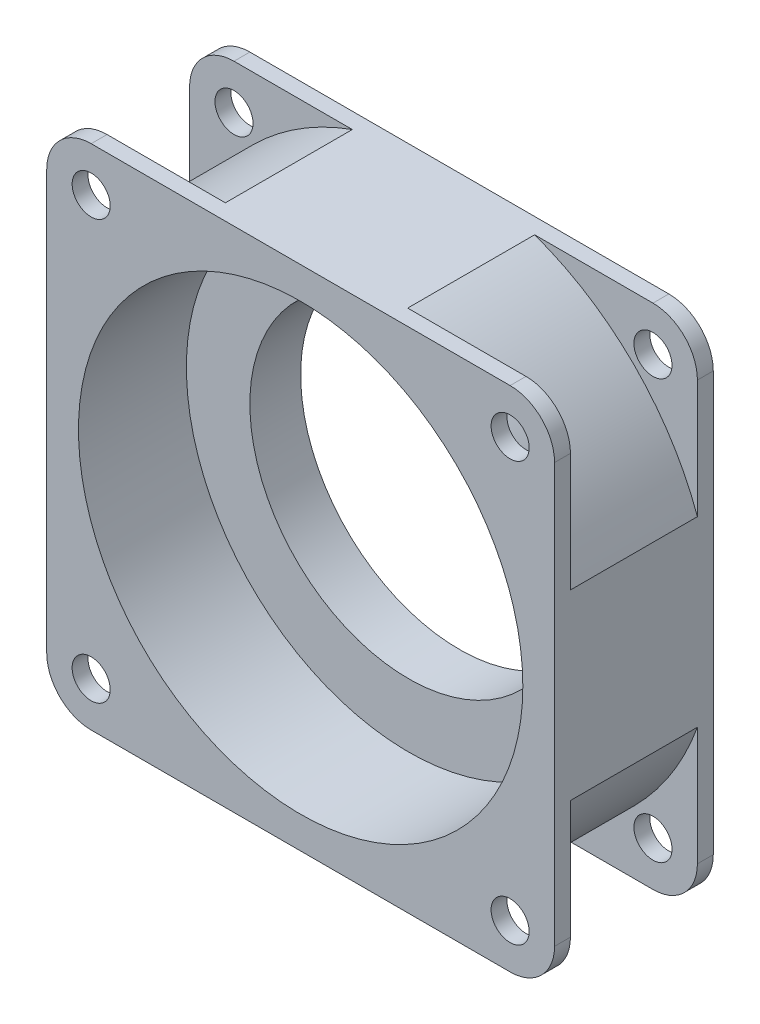
ISO-10303-21;
HEADER;
FILE_DESCRIPTION(('STEP AP214'),'2;1');
FILE_NAME('part.step','',(''),(''),'','','');
FILE_SCHEMA(('AUTOMOTIVE_DESIGN { 1 0 10303 214 1 1 1 1 }'));
ENDSEC;
DATA;
#1=APPLICATION_CONTEXT('core data for automotive mechanical design processes');
#2=APPLICATION_PROTOCOL_DEFINITION('international standard','automotive_design',2000,#1);
#3=PRODUCT_CONTEXT('',#1,'mechanical');
#4=PRODUCT('Part','Part','',(#3));
#5=PRODUCT_RELATED_PRODUCT_CATEGORY('part','',(#4));
#6=PRODUCT_DEFINITION_FORMATION('','',#4);
#7=PRODUCT_DEFINITION_CONTEXT('part definition',#1,'design');
#8=PRODUCT_DEFINITION('design','',#6,#7);
#9=PRODUCT_DEFINITION_SHAPE('','',#8);
#10=(LENGTH_UNIT() NAMED_UNIT(*) SI_UNIT(.MILLI.,.METRE.));
#11=(NAMED_UNIT(*) PLANE_ANGLE_UNIT() SI_UNIT($,.RADIAN.));
#12=(NAMED_UNIT(*) SI_UNIT($,.STERADIAN.) SOLID_ANGLE_UNIT());
#13=UNCERTAINTY_MEASURE_WITH_UNIT(LENGTH_MEASURE(1.E-05),#10,'distance_accuracy_value','');
#14=(GEOMETRIC_REPRESENTATION_CONTEXT(3) GLOBAL_UNCERTAINTY_ASSIGNED_CONTEXT((#13)) GLOBAL_UNIT_ASSIGNED_CONTEXT((#10,
#11,#12)) REPRESENTATION_CONTEXT('',''));
#15=CARTESIAN_POINT('',(0.,0.,0.));
#16=DIRECTION('',(0.,0.,1.));
#17=DIRECTION('',(1.,0.,0.));
#18=AXIS2_PLACEMENT_3D('',#15,#16,#17);
#19=CARTESIAN_POINT('',(0.,0.,12.5));
#20=DIRECTION('',(0.,0.,-1.));
#21=DIRECTION('',(-1.,0.,0.));
#22=AXIS2_PLACEMENT_3D('',#19,#20,#21);
#23=CYLINDRICAL_SURFACE('',#22,25.);
#24=CARTESIAN_POINT('',(0.,0.,-12.5));
#25=DIRECTION('',(0.,0.,1.));
#26=DIRECTION('',(1.,0.,0.));
#27=AXIS2_PLACEMENT_3D('',#24,#25,#26);
#28=CIRCLE('',#27,25.);
#29=CARTESIAN_POINT('',(25.,0.,-12.5));
#30=VERTEX_POINT('',#29);
#31=EDGE_CURVE('E305',#30,#30,#28,.T.);
#32=ORIENTED_EDGE('',*,*,#31,.F.);
#33=EDGE_LOOP('',(#32));
#34=FACE_BOUND('',#33,.T.);
#35=CARTESIAN_POINT('',(0.,0.,-4.5));
#36=DIRECTION('',(0.,0.,1.));
#37=DIRECTION('',(1.,0.,0.));
#38=AXIS2_PLACEMENT_3D('',#35,#36,#37);
#39=CIRCLE('',#38,25.);
#40=CARTESIAN_POINT('',(25.,0.,-4.5));
#41=VERTEX_POINT('',#40);
#42=EDGE_CURVE('E539',#41,#41,#39,.T.);
#43=ORIENTED_EDGE('',*,*,#42,.T.);
#44=EDGE_LOOP('',(#43));
#45=FACE_BOUND('',#44,.T.);
#46=ADVANCED_FACE('F50',(#34,#45),#23,.F.);
#47=CARTESIAN_POINT('',(0.,40.,12.5));
#48=DIRECTION('',(0.,1.,0.));
#49=DIRECTION('',(0.,0.,1.));
#50=AXIS2_PLACEMENT_3D('',#47,#48,#49);
#51=PLANE('',#50);
#52=DIRECTION('',(0.,0.,-1.));
#53=VECTOR('',#52,1.);
#54=CARTESIAN_POINT('',(33.,40.,12.5));
#55=LINE('',#54,#53);
#56=CARTESIAN_POINT('',(33.,40.,12.5));
#57=VERTEX_POINT('',#56);
#58=CARTESIAN_POINT('',(33.,40.,10.));
#59=VERTEX_POINT('',#58);
#60=EDGE_CURVE('E12',#57,#59,#55,.T.);
#61=ORIENTED_EDGE('',*,*,#60,.T.);
#62=DIRECTION('',(-1.,0.,0.));
#63=VECTOR('',#62,1.);
#64=CARTESIAN_POINT('',(0.,40.,10.));
#65=LINE('',#64,#63);
#66=CARTESIAN_POINT('',(14.3614066163451,40.,10.));
#67=VERTEX_POINT('',#66);
#68=EDGE_CURVE('E454',#59,#67,#65,.T.);
#69=ORIENTED_EDGE('',*,*,#68,.T.);
#70=DIRECTION('',(0.,0.,1.));
#71=VECTOR('',#70,1.);
#72=CARTESIAN_POINT('',(14.3614066163451,40.,-10.));
#73=LINE('',#72,#71);
#74=CARTESIAN_POINT('',(14.3614066163451,40.,-10.));
#75=VERTEX_POINT('',#74);
#76=EDGE_CURVE('E229',#75,#67,#73,.T.);
#77=ORIENTED_EDGE('',*,*,#76,.F.);
#78=DIRECTION('',(-1.,0.,0.));
#79=VECTOR('',#78,1.);
#80=CARTESIAN_POINT('',(0.,40.,-10.));
#81=LINE('',#80,#79);
#82=CARTESIAN_POINT('',(33.,40.,-10.));
#83=VERTEX_POINT('',#82);
#84=EDGE_CURVE('E212',#83,#75,#81,.T.);
#85=ORIENTED_EDGE('',*,*,#84,.F.);
#86=CARTESIAN_POINT('',(33.,40.,-12.5));
#87=VERTEX_POINT('',#86);
#88=EDGE_CURVE('E57',#83,#87,#55,.T.);
#89=ORIENTED_EDGE('',*,*,#88,.T.);
#90=DIRECTION('',(1.,0.,0.));
#91=VECTOR('',#90,1.);
#92=CARTESIAN_POINT('',(0.,40.,-12.5));
#93=LINE('',#92,#91);
#94=CARTESIAN_POINT('',(-33.,40.,-12.5));
#95=VERTEX_POINT('',#94);
#96=EDGE_CURVE('E264',#95,#87,#93,.T.);
#97=ORIENTED_EDGE('',*,*,#96,.F.);
#98=DIRECTION('',(0.,0.,-1.));
#99=VECTOR('',#98,1.);
#100=CARTESIAN_POINT('',(-33.,40.,12.5));
#101=LINE('',#100,#99);
#102=CARTESIAN_POINT('',(-33.,40.,-10.));
#103=VERTEX_POINT('',#102);
#104=EDGE_CURVE('E237',#103,#95,#101,.T.);
#105=ORIENTED_EDGE('',*,*,#104,.F.);
#106=DIRECTION('',(1.,0.,0.));
#107=VECTOR('',#106,1.);
#108=CARTESIAN_POINT('',(0.,40.,-10.));
#109=LINE('',#108,#107);
#110=CARTESIAN_POINT('',(-14.3614066163451,40.,-10.));
#111=VERTEX_POINT('',#110);
#112=EDGE_CURVE('E378',#103,#111,#109,.T.);
#113=ORIENTED_EDGE('',*,*,#112,.T.);
#114=DIRECTION('',(0.,0.,1.));
#115=VECTOR('',#114,1.);
#116=CARTESIAN_POINT('',(-14.3614066163451,40.,-10.));
#117=LINE('',#116,#115);
#118=CARTESIAN_POINT('',(-14.3614066163451,40.,10.));
#119=VERTEX_POINT('',#118);
#120=EDGE_CURVE('E241',#111,#119,#117,.T.);
#121=ORIENTED_EDGE('',*,*,#120,.T.);
#122=DIRECTION('',(1.,0.,0.));
#123=VECTOR('',#122,1.);
#124=CARTESIAN_POINT('',(0.,40.,10.));
#125=LINE('',#124,#123);
#126=CARTESIAN_POINT('',(-33.,40.,10.));
#127=VERTEX_POINT('',#126);
#128=EDGE_CURVE('E389',#127,#119,#125,.T.);
#129=ORIENTED_EDGE('',*,*,#128,.F.);
#130=CARTESIAN_POINT('',(-33.,40.,12.5));
#131=VERTEX_POINT('',#130);
#132=EDGE_CURVE('E234',#131,#127,#101,.T.);
#133=ORIENTED_EDGE('',*,*,#132,.F.);
#134=DIRECTION('',(1.,0.,0.));
#135=VECTOR('',#134,1.);
#136=CARTESIAN_POINT('',(0.,40.,12.5));
#137=LINE('',#136,#135);
#138=EDGE_CURVE('E401',#131,#57,#137,.T.);
#139=ORIENTED_EDGE('',*,*,#138,.T.);
#140=EDGE_LOOP('',(#61,#69,#77,#85,#89,#97,#105,#113,#121,#129,#133,#139));
#141=FACE_BOUND('',#140,.T.);
#142=ADVANCED_FACE('F221',(#141),#51,.T.);
#143=CARTESIAN_POINT('',(-40.,0.,12.5));
#144=DIRECTION('',(-1.,0.,0.));
#145=DIRECTION('',(0.,0.,1.));
#146=AXIS2_PLACEMENT_3D('',#143,#144,#145);
#147=PLANE('',#146);
#148=DIRECTION('',(0.,0.,1.));
#149=VECTOR('',#148,1.);
#150=CARTESIAN_POINT('',(-40.,-14.3614066163451,-10.));
#151=LINE('',#150,#149);
#152=CARTESIAN_POINT('',(-40.,-14.3614066163451,-10.));
#153=VERTEX_POINT('',#152);
#154=CARTESIAN_POINT('',(-40.,-14.3614066163451,10.));
#155=VERTEX_POINT('',#154);
#156=EDGE_CURVE('E360',#153,#155,#151,.T.);
#157=ORIENTED_EDGE('',*,*,#156,.T.);
#158=DIRECTION('',(0.,-1.,0.));
#159=VECTOR('',#158,1.);
#160=CARTESIAN_POINT('',(-40.,0.,10.));
#161=LINE('',#160,#159);
#162=CARTESIAN_POINT('',(-40.,-32.9999999999999,10.));
#163=VERTEX_POINT('',#162);
#164=EDGE_CURVE('E372',#155,#163,#161,.T.);
#165=ORIENTED_EDGE('',*,*,#164,.T.);
#166=DIRECTION('',(0.,0.,-1.));
#167=VECTOR('',#166,1.);
#168=CARTESIAN_POINT('',(-40.,-33.,12.5));
#169=LINE('',#168,#167);
#170=CARTESIAN_POINT('',(-40.,-33.,12.5));
#171=VERTEX_POINT('',#170);
#172=EDGE_CURVE('E323',#171,#163,#169,.T.);
#173=ORIENTED_EDGE('',*,*,#172,.F.);
#174=DIRECTION('',(0.,1.,0.));
#175=VECTOR('',#174,1.);
#176=CARTESIAN_POINT('',(-40.,0.,12.5));
#177=LINE('',#176,#175);
#178=CARTESIAN_POINT('',(-40.,33.,12.5));
#179=VERTEX_POINT('',#178);
#180=EDGE_CURVE('E409',#171,#179,#177,.T.);
#181=ORIENTED_EDGE('',*,*,#180,.T.);
#182=DIRECTION('',(0.,0.,-1.));
#183=VECTOR('',#182,1.);
#184=CARTESIAN_POINT('',(-40.,33.,12.5));
#185=LINE('',#184,#183);
#186=CARTESIAN_POINT('',(-40.,33.,10.));
#187=VERTEX_POINT('',#186);
#188=EDGE_CURVE('E326',#179,#187,#185,.T.);
#189=ORIENTED_EDGE('',*,*,#188,.T.);
#190=DIRECTION('',(0.,1.,0.));
#191=VECTOR('',#190,1.);
#192=CARTESIAN_POINT('',(-40.,0.,10.));
#193=LINE('',#192,#191);
#194=CARTESIAN_POINT('',(-40.,14.3614066163451,10.));
#195=VERTEX_POINT('',#194);
#196=EDGE_CURVE('E393',#195,#187,#193,.T.);
#197=ORIENTED_EDGE('',*,*,#196,.F.);
#198=DIRECTION('',(0.,0.,1.));
#199=VECTOR('',#198,1.);
#200=CARTESIAN_POINT('',(-40.,14.3614066163451,-10.));
#201=LINE('',#200,#199);
#202=CARTESIAN_POINT('',(-40.,14.3614066163451,-10.));
#203=VERTEX_POINT('',#202);
#204=EDGE_CURVE('E390',#203,#195,#201,.T.);
#205=ORIENTED_EDGE('',*,*,#204,.F.);
#206=DIRECTION('',(0.,1.,0.));
#207=VECTOR('',#206,1.);
#208=CARTESIAN_POINT('',(-40.,0.,-10.));
#209=LINE('',#208,#207);
#210=CARTESIAN_POINT('',(-40.,33.,-10.));
#211=VERTEX_POINT('',#210);
#212=EDGE_CURVE('E61',#203,#211,#209,.T.);
#213=ORIENTED_EDGE('',*,*,#212,.T.);
#214=CARTESIAN_POINT('',(-40.,33.,-12.5));
#215=VERTEX_POINT('',#214);
#216=EDGE_CURVE('E324',#211,#215,#185,.T.);
#217=ORIENTED_EDGE('',*,*,#216,.T.);
#218=DIRECTION('',(0.,1.,0.));
#219=VECTOR('',#218,1.);
#220=CARTESIAN_POINT('',(-40.,0.,-12.5));
#221=LINE('',#220,#219);
#222=CARTESIAN_POINT('',(-40.,-33.,-12.5));
#223=VERTEX_POINT('',#222);
#224=EDGE_CURVE('E274',#223,#215,#221,.T.);
#225=ORIENTED_EDGE('',*,*,#224,.F.);
#226=CARTESIAN_POINT('',(-40.,-32.9999999999999,-10.));
#227=VERTEX_POINT('',#226);
#228=EDGE_CURVE('E325',#227,#223,#169,.T.);
#229=ORIENTED_EDGE('',*,*,#228,.F.);
#230=DIRECTION('',(0.,-1.,0.));
#231=VECTOR('',#230,1.);
#232=CARTESIAN_POINT('',(-40.,0.,-10.));
#233=LINE('',#232,#231);
#234=EDGE_CURVE('E353',#153,#227,#233,.T.);
#235=ORIENTED_EDGE('',*,*,#234,.F.);
#236=EDGE_LOOP('',(#157,#165,#173,#181,#189,#197,#205,#213,#217,#225,#229,#235));
#237=FACE_BOUND('',#236,.T.);
#238=ADVANCED_FACE('F333',(#237),#147,.T.);
#239=CARTESIAN_POINT('',(0.,-40.,12.5));
#240=DIRECTION('',(0.,1.,0.));
#241=DIRECTION('',(0.,0.,1.));
#242=AXIS2_PLACEMENT_3D('',#239,#240,#241);
#243=PLANE('',#242);
#244=DIRECTION('',(0.,0.,-1.));
#245=VECTOR('',#244,1.);
#246=CARTESIAN_POINT('',(-33.,-40.,12.5));
#247=LINE('',#246,#245);
#248=CARTESIAN_POINT('',(-33.,-40.,12.5));
#249=VERTEX_POINT('',#248);
#250=CARTESIAN_POINT('',(-33.,-40.,10.));
#251=VERTEX_POINT('',#250);
#252=EDGE_CURVE('E317',#249,#251,#247,.T.);
#253=ORIENTED_EDGE('',*,*,#252,.T.);
#254=DIRECTION('',(1.,0.,0.));
#255=VECTOR('',#254,1.);
#256=CARTESIAN_POINT('',(0.,-40.,10.));
#257=LINE('',#256,#255);
#258=CARTESIAN_POINT('',(-14.3614066163451,-40.,10.));
#259=VERTEX_POINT('',#258);
#260=EDGE_CURVE('E370',#251,#259,#257,.T.);
#261=ORIENTED_EDGE('',*,*,#260,.T.);
#262=DIRECTION('',(0.,0.,1.));
#263=VECTOR('',#262,1.);
#264=CARTESIAN_POINT('',(-14.3614066163451,-40.,-10.));
#265=LINE('',#264,#263);
#266=CARTESIAN_POINT('',(-14.3614066163451,-40.,-10.));
#267=VERTEX_POINT('',#266);
#268=EDGE_CURVE('E358',#267,#259,#265,.T.);
#269=ORIENTED_EDGE('',*,*,#268,.F.);
#270=DIRECTION('',(1.,0.,0.));
#271=VECTOR('',#270,1.);
#272=CARTESIAN_POINT('',(0.,-40.,-10.));
#273=LINE('',#272,#271);
#274=CARTESIAN_POINT('',(-33.,-40.,-10.));
#275=VERTEX_POINT('',#274);
#276=EDGE_CURVE('E75',#275,#267,#273,.T.);
#277=ORIENTED_EDGE('',*,*,#276,.F.);
#278=CARTESIAN_POINT('',(-33.,-40.,-12.5));
#279=VERTEX_POINT('',#278);
#280=EDGE_CURVE('E318',#275,#279,#247,.T.);
#281=ORIENTED_EDGE('',*,*,#280,.T.);
#282=DIRECTION('',(1.,0.,0.));
#283=VECTOR('',#282,1.);
#284=CARTESIAN_POINT('',(0.,-40.,-12.5));
#285=LINE('',#284,#283);
#286=CARTESIAN_POINT('',(33.,-40.,-12.5));
#287=VERTEX_POINT('',#286);
#288=EDGE_CURVE('E282',#279,#287,#285,.T.);
#289=ORIENTED_EDGE('',*,*,#288,.T.);
#290=DIRECTION('',(0.,0.,-1.));
#291=VECTOR('',#290,1.);
#292=CARTESIAN_POINT('',(33.,-40.,12.5));
#293=LINE('',#292,#291);
#294=CARTESIAN_POINT('',(33.,-40.,-10.));
#295=VERTEX_POINT('',#294);
#296=EDGE_CURVE('E314',#295,#287,#293,.T.);
#297=ORIENTED_EDGE('',*,*,#296,.F.);
#298=DIRECTION('',(-1.,0.,0.));
#299=VECTOR('',#298,1.);
#300=CARTESIAN_POINT('',(0.,-40.,-10.));
#301=LINE('',#300,#299);
#302=CARTESIAN_POINT('',(14.3614066163451,-40.,-10.));
#303=VERTEX_POINT('',#302);
#304=EDGE_CURVE('E479',#295,#303,#301,.T.);
#305=ORIENTED_EDGE('',*,*,#304,.T.);
#306=DIRECTION('',(0.,0.,1.));
#307=VECTOR('',#306,1.);
#308=CARTESIAN_POINT('',(14.3614066163451,-40.,-10.));
#309=LINE('',#308,#307);
#310=CARTESIAN_POINT('',(14.3614066163451,-40.,10.));
#311=VERTEX_POINT('',#310);
#312=EDGE_CURVE('E464',#303,#311,#309,.T.);
#313=ORIENTED_EDGE('',*,*,#312,.T.);
#314=DIRECTION('',(-1.,0.,0.));
#315=VECTOR('',#314,1.);
#316=CARTESIAN_POINT('',(0.,-40.,10.));
#317=LINE('',#316,#315);
#318=CARTESIAN_POINT('',(33.,-40.,10.));
#319=VERTEX_POINT('',#318);
#320=EDGE_CURVE('E376',#319,#311,#317,.T.);
#321=ORIENTED_EDGE('',*,*,#320,.F.);
#322=CARTESIAN_POINT('',(33.,-40.,12.5));
#323=VERTEX_POINT('',#322);
#324=EDGE_CURVE('E312',#323,#319,#293,.T.);
#325=ORIENTED_EDGE('',*,*,#324,.F.);
#326=DIRECTION('',(1.,0.,0.));
#327=VECTOR('',#326,1.);
#328=CARTESIAN_POINT('',(0.,-40.,12.5));
#329=LINE('',#328,#327);
#330=EDGE_CURVE('E413',#249,#323,#329,.T.);
#331=ORIENTED_EDGE('',*,*,#330,.F.);
#332=EDGE_LOOP('',(#253,#261,#269,#277,#281,#289,#297,#305,#313,#321,#325,#331));
#333=FACE_BOUND('',#332,.T.);
#334=ADVANCED_FACE('F513',(#333),#243,.F.);
#335=CARTESIAN_POINT('',(40.,0.,12.5));
#336=DIRECTION('',(-1.,0.,0.));
#337=DIRECTION('',(0.,0.,1.));
#338=AXIS2_PLACEMENT_3D('',#335,#336,#337);
#339=PLANE('',#338);
#340=DIRECTION('',(0.,-1.,0.));
#341=VECTOR('',#340,1.);
#342=CARTESIAN_POINT('',(40.,0.,10.));
#343=LINE('',#342,#341);
#344=CARTESIAN_POINT('',(40.,-14.3614066163451,10.));
#345=VERTEX_POINT('',#344);
#346=CARTESIAN_POINT('',(40.,-32.9999999999999,10.));
#347=VERTEX_POINT('',#346);
#348=EDGE_CURVE('E494',#345,#347,#343,.T.);
#349=ORIENTED_EDGE('',*,*,#348,.F.);
#350=DIRECTION('',(0.,0.,1.));
#351=VECTOR('',#350,1.);
#352=CARTESIAN_POINT('',(40.,-14.3614066163451,-10.));
#353=LINE('',#352,#351);
#354=CARTESIAN_POINT('',(40.,-14.3614066163451,-10.));
#355=VERTEX_POINT('',#354);
#356=EDGE_CURVE('E468',#355,#345,#353,.T.);
#357=ORIENTED_EDGE('',*,*,#356,.F.);
#358=DIRECTION('',(0.,-1.,0.));
#359=VECTOR('',#358,1.);
#360=CARTESIAN_POINT('',(40.,0.,-10.));
#361=LINE('',#360,#359);
#362=CARTESIAN_POINT('',(40.,-32.9999999999999,-10.));
#363=VERTEX_POINT('',#362);
#364=EDGE_CURVE('E484',#355,#363,#361,.T.);
#365=ORIENTED_EDGE('',*,*,#364,.T.);
#366=DIRECTION('',(0.,0.,-1.));
#367=VECTOR('',#366,1.);
#368=CARTESIAN_POINT('',(40.,-33.,12.5));
#369=LINE('',#368,#367);
#370=CARTESIAN_POINT('',(40.,-33.,-12.5));
#371=VERTEX_POINT('',#370);
#372=EDGE_CURVE('E310',#363,#371,#369,.T.);
#373=ORIENTED_EDGE('',*,*,#372,.T.);
#374=DIRECTION('',(0.,1.,0.));
#375=VECTOR('',#374,1.);
#376=CARTESIAN_POINT('',(40.,0.,-12.5));
#377=LINE('',#376,#375);
#378=CARTESIAN_POINT('',(40.,33.,-12.5));
#379=VERTEX_POINT('',#378);
#380=EDGE_CURVE('E290',#371,#379,#377,.T.);
#381=ORIENTED_EDGE('',*,*,#380,.T.);
#382=DIRECTION('',(0.,0.,-1.));
#383=VECTOR('',#382,1.);
#384=CARTESIAN_POINT('',(40.,33.,12.5));
#385=LINE('',#384,#383);
#386=CARTESIAN_POINT('',(40.,32.9999999999999,-10.));
#387=VERTEX_POINT('',#386);
#388=EDGE_CURVE('E309',#387,#379,#385,.T.);
#389=ORIENTED_EDGE('',*,*,#388,.F.);
#390=DIRECTION('',(0.,1.,0.));
#391=VECTOR('',#390,1.);
#392=CARTESIAN_POINT('',(40.,0.,-10.));
#393=LINE('',#392,#391);
#394=CARTESIAN_POINT('',(40.,14.3614066163451,-10.));
#395=VERTEX_POINT('',#394);
#396=EDGE_CURVE('E220',#395,#387,#393,.T.);
#397=ORIENTED_EDGE('',*,*,#396,.F.);
#398=DIRECTION('',(0.,0.,1.));
#399=VECTOR('',#398,1.);
#400=CARTESIAN_POINT('',(40.,14.3614066163451,-10.));
#401=LINE('',#400,#399);
#402=CARTESIAN_POINT('',(40.,14.3614066163451,10.));
#403=VERTEX_POINT('',#402);
#404=EDGE_CURVE('E395',#395,#403,#401,.T.);
#405=ORIENTED_EDGE('',*,*,#404,.T.);
#406=DIRECTION('',(0.,1.,0.));
#407=VECTOR('',#406,1.);
#408=CARTESIAN_POINT('',(40.,0.,10.));
#409=LINE('',#408,#407);
#410=CARTESIAN_POINT('',(40.,32.9999999999999,10.));
#411=VERTEX_POINT('',#410);
#412=EDGE_CURVE('E222',#403,#411,#409,.T.);
#413=ORIENTED_EDGE('',*,*,#412,.T.);
#414=CARTESIAN_POINT('',(40.,33.,12.5));
#415=VERTEX_POINT('',#414);
#416=EDGE_CURVE('E308',#415,#411,#385,.T.);
#417=ORIENTED_EDGE('',*,*,#416,.F.);
#418=DIRECTION('',(0.,1.,0.));
#419=VECTOR('',#418,1.);
#420=CARTESIAN_POINT('',(40.,0.,12.5));
#421=LINE('',#420,#419);
#422=CARTESIAN_POINT('',(40.,-33.,12.5));
#423=VERTEX_POINT('',#422);
#424=EDGE_CURVE('E417',#423,#415,#421,.T.);
#425=ORIENTED_EDGE('',*,*,#424,.F.);
#426=EDGE_CURVE('E313',#423,#347,#369,.T.);
#427=ORIENTED_EDGE('',*,*,#426,.T.);
#428=EDGE_LOOP('',(#349,#357,#365,#373,#381,#389,#397,#405,#413,#417,#425,#427));
#429=FACE_BOUND('',#428,.T.);
#430=ADVANCED_FACE('F432',(#429),#339,.F.);
#431=CARTESIAN_POINT('',(33.,33.,12.5));
#432=DIRECTION('',(0.,0.,-1.));
#433=DIRECTION('',(-1.,0.,0.));
#434=AXIS2_PLACEMENT_3D('',#431,#432,#433);
#435=CYLINDRICAL_SURFACE('',#434,7.00000000000001);
#436=CARTESIAN_POINT('',(33.,33.,10.));
#437=DIRECTION('',(0.,0.,1.));
#438=DIRECTION('',(1.,0.,0.));
#439=AXIS2_PLACEMENT_3D('',#436,#437,#438);
#440=CIRCLE('',#439,7.);
#441=EDGE_CURVE('E456',#59,#411,#440,.F.);
#442=ORIENTED_EDGE('',*,*,#441,.F.);
#443=ORIENTED_EDGE('',*,*,#60,.F.);
#444=CARTESIAN_POINT('',(33.,33.,12.5));
#445=DIRECTION('',(0.,0.,1.));
#446=DIRECTION('',(1.,0.,0.));
#447=AXIS2_PLACEMENT_3D('',#444,#445,#446);
#448=CIRCLE('',#447,7.00000000000001);
#449=EDGE_CURVE('E301',#415,#57,#448,.T.);
#450=ORIENTED_EDGE('',*,*,#449,.F.);
#451=ORIENTED_EDGE('',*,*,#416,.T.);
#452=EDGE_LOOP('',(#442,#443,#450,#451));
#453=FACE_BOUND('',#452,.T.);
#454=ADVANCED_FACE('F460',(#453),#435,.T.);
#455=CARTESIAN_POINT('',(-33.,33.,12.5));
#456=DIRECTION('',(0.,0.,-1.));
#457=DIRECTION('',(-1.,0.,0.));
#458=AXIS2_PLACEMENT_3D('',#455,#456,#457);
#459=CYLINDRICAL_SURFACE('',#458,7.);
#460=CARTESIAN_POINT('',(-33.,33.,-10.));
#461=DIRECTION('',(0.,0.,1.));
#462=DIRECTION('',(1.,0.,0.));
#463=AXIS2_PLACEMENT_3D('',#460,#461,#462);
#464=CIRCLE('',#463,7.);
#465=EDGE_CURVE('E381',#103,#211,#464,.T.);
#466=ORIENTED_EDGE('',*,*,#465,.F.);
#467=ORIENTED_EDGE('',*,*,#104,.T.);
#468=CARTESIAN_POINT('',(-33.,33.,-12.5));
#469=DIRECTION('',(0.,0.,1.));
#470=DIRECTION('',(1.,0.,0.));
#471=AXIS2_PLACEMENT_3D('',#468,#469,#470);
#472=CIRCLE('',#471,7.);
#473=EDGE_CURVE('E270',#95,#215,#472,.T.);
#474=ORIENTED_EDGE('',*,*,#473,.T.);
#475=ORIENTED_EDGE('',*,*,#216,.F.);
#476=EDGE_LOOP('',(#466,#467,#474,#475));
#477=FACE_BOUND('',#476,.T.);
#478=ADVANCED_FACE('F342',(#477),#459,.T.);
#479=CARTESIAN_POINT('',(-33.,-33.,12.5));
#480=DIRECTION('',(0.,0.,-1.));
#481=DIRECTION('',(-1.,0.,0.));
#482=AXIS2_PLACEMENT_3D('',#479,#480,#481);
#483=CYLINDRICAL_SURFACE('',#482,7.);
#484=ORIENTED_EDGE('',*,*,#280,.F.);
#485=CARTESIAN_POINT('',(-33.,-33.,-10.));
#486=DIRECTION('',(0.,0.,1.));
#487=DIRECTION('',(1.,0.,0.));
#488=AXIS2_PLACEMENT_3D('',#485,#486,#487);
#489=CIRCLE('',#488,7.);
#490=EDGE_CURVE('E354',#275,#227,#489,.F.);
#491=ORIENTED_EDGE('',*,*,#490,.T.);
#492=ORIENTED_EDGE('',*,*,#228,.T.);
#493=CARTESIAN_POINT('',(-33.,-33.,-12.5));
#494=DIRECTION('',(0.,0.,1.));
#495=DIRECTION('',(1.,0.,0.));
#496=AXIS2_PLACEMENT_3D('',#493,#494,#495);
#497=CIRCLE('',#496,7.);
#498=EDGE_CURVE('E279',#279,#223,#497,.F.);
#499=ORIENTED_EDGE('',*,*,#498,.F.);
#500=EDGE_LOOP('',(#484,#491,#492,#499));
#501=FACE_BOUND('',#500,.T.);
#502=ADVANCED_FACE('F352',(#501),#483,.T.);
#503=CARTESIAN_POINT('',(33.,-33.,12.5));
#504=DIRECTION('',(0.,0.,-1.));
#505=DIRECTION('',(-1.,0.,0.));
#506=AXIS2_PLACEMENT_3D('',#503,#504,#505);
#507=CYLINDRICAL_SURFACE('',#506,7.00000000000001);
#508=CARTESIAN_POINT('',(33.,-33.,-10.));
#509=DIRECTION('',(0.,0.,1.));
#510=DIRECTION('',(1.,0.,0.));
#511=AXIS2_PLACEMENT_3D('',#508,#509,#510);
#512=CIRCLE('',#511,7.);
#513=EDGE_CURVE('E485',#295,#363,#512,.T.);
#514=ORIENTED_EDGE('',*,*,#513,.F.);
#515=ORIENTED_EDGE('',*,*,#296,.T.);
#516=CARTESIAN_POINT('',(33.,-33.,-12.5));
#517=DIRECTION('',(0.,0.,1.));
#518=DIRECTION('',(1.,0.,0.));
#519=AXIS2_PLACEMENT_3D('',#516,#517,#518);
#520=CIRCLE('',#519,7.00000000000001);
#521=EDGE_CURVE('E281',#287,#371,#520,.T.);
#522=ORIENTED_EDGE('',*,*,#521,.T.);
#523=ORIENTED_EDGE('',*,*,#372,.F.);
#524=EDGE_LOOP('',(#514,#515,#522,#523));
#525=FACE_BOUND('',#524,.T.);
#526=ADVANCED_FACE('F525',(#525),#507,.T.);
#527=CARTESIAN_POINT('',(-33.,33.,12.5));
#528=DIRECTION('',(0.,0.,-1.));
#529=DIRECTION('',(-1.,0.,0.));
#530=AXIS2_PLACEMENT_3D('',#527,#528,#529);
#531=CYLINDRICAL_SURFACE('',#530,3.00000000000001);
#532=CARTESIAN_POINT('',(-33.,33.,-12.5));
#533=DIRECTION('',(0.,0.,1.));
#534=DIRECTION('',(1.,0.,0.));
#535=AXIS2_PLACEMENT_3D('',#532,#533,#534);
#536=CIRCLE('',#535,3.00000000000001);
#537=CARTESIAN_POINT('',(-30.,33.,-12.5));
#538=VERTEX_POINT('',#537);
#539=EDGE_CURVE('E296',#538,#538,#536,.T.);
#540=ORIENTED_EDGE('',*,*,#539,.F.);
#541=EDGE_LOOP('',(#540));
#542=FACE_BOUND('',#541,.T.);
#543=CARTESIAN_POINT('',(-33.,33.,-10.));
#544=DIRECTION('',(0.,0.,1.));
#545=DIRECTION('',(1.,0.,0.));
#546=AXIS2_PLACEMENT_3D('',#543,#544,#545);
#547=CIRCLE('',#546,3.00000000000001);
#548=CARTESIAN_POINT('',(-30.,33.,-10.));
#549=VERTEX_POINT('',#548);
#550=EDGE_CURVE('E51',#549,#549,#547,.T.);
#551=ORIENTED_EDGE('',*,*,#550,.T.);
#552=EDGE_LOOP('',(#551));
#553=FACE_BOUND('',#552,.T.);
#554=ADVANCED_FACE('F588',(#542,#553),#531,.F.);
#555=CARTESIAN_POINT('',(33.,33.,12.5));
#556=DIRECTION('',(0.,0.,-1.));
#557=DIRECTION('',(-1.,0.,0.));
#558=AXIS2_PLACEMENT_3D('',#555,#556,#557);
#559=CYLINDRICAL_SURFACE('',#558,3.00000000000001);
#560=CARTESIAN_POINT('',(33.,33.,-12.5));
#561=DIRECTION('',(0.,0.,1.));
#562=DIRECTION('',(1.,0.,0.));
#563=AXIS2_PLACEMENT_3D('',#560,#561,#562);
#564=CIRCLE('',#563,3.00000000000001);
#565=CARTESIAN_POINT('',(36.,33.,-12.5));
#566=VERTEX_POINT('',#565);
#567=EDGE_CURVE('E297',#566,#566,#564,.T.);
#568=ORIENTED_EDGE('',*,*,#567,.F.);
#569=EDGE_LOOP('',(#568));
#570=FACE_BOUND('',#569,.T.);
#571=CARTESIAN_POINT('',(33.,33.,-10.));
#572=DIRECTION('',(0.,0.,1.));
#573=DIRECTION('',(1.,0.,0.));
#574=AXIS2_PLACEMENT_3D('',#571,#572,#573);
#575=CIRCLE('',#574,3.00000000000001);
#576=CARTESIAN_POINT('',(36.,33.,-10.));
#577=VERTEX_POINT('',#576);
#578=EDGE_CURVE('E258',#577,#577,#575,.T.);
#579=ORIENTED_EDGE('',*,*,#578,.T.);
#580=EDGE_LOOP('',(#579));
#581=FACE_BOUND('',#580,.T.);
#582=ADVANCED_FACE('F587',(#570,#581),#559,.F.);
#583=CARTESIAN_POINT('',(-33.,-33.,12.5));
#584=DIRECTION('',(0.,0.,-1.));
#585=DIRECTION('',(-1.,0.,0.));
#586=AXIS2_PLACEMENT_3D('',#583,#584,#585);
#587=CYLINDRICAL_SURFACE('',#586,3.00000000000001);
#588=CARTESIAN_POINT('',(-33.,-33.,-12.5));
#589=DIRECTION('',(0.,0.,1.));
#590=DIRECTION('',(1.,0.,0.));
#591=AXIS2_PLACEMENT_3D('',#588,#589,#590);
#592=CIRCLE('',#591,3.00000000000001);
#593=CARTESIAN_POINT('',(-30.,-33.,-12.5));
#594=VERTEX_POINT('',#593);
#595=EDGE_CURVE('E291',#594,#594,#592,.T.);
#596=ORIENTED_EDGE('',*,*,#595,.F.);
#597=EDGE_LOOP('',(#596));
#598=FACE_BOUND('',#597,.T.);
#599=CARTESIAN_POINT('',(-33.,-33.,-10.));
#600=DIRECTION('',(0.,0.,1.));
#601=DIRECTION('',(1.,0.,0.));
#602=AXIS2_PLACEMENT_3D('',#599,#600,#601);
#603=CIRCLE('',#602,3.00000000000001);
#604=CARTESIAN_POINT('',(-30.,-33.,-10.));
#605=VERTEX_POINT('',#604);
#606=EDGE_CURVE('E246',#605,#605,#603,.T.);
#607=ORIENTED_EDGE('',*,*,#606,.T.);
#608=EDGE_LOOP('',(#607));
#609=FACE_BOUND('',#608,.T.);
#610=ADVANCED_FACE('F593',(#598,#609),#587,.F.);
#611=CARTESIAN_POINT('',(33.,-33.,12.5));
#612=DIRECTION('',(0.,0.,-1.));
#613=DIRECTION('',(-1.,0.,0.));
#614=AXIS2_PLACEMENT_3D('',#611,#612,#613);
#615=CYLINDRICAL_SURFACE('',#614,3.00000000000001);
#616=CARTESIAN_POINT('',(33.,-33.,-12.5));
#617=DIRECTION('',(0.,0.,1.));
#618=DIRECTION('',(1.,0.,0.));
#619=AXIS2_PLACEMENT_3D('',#616,#617,#618);
#620=CIRCLE('',#619,3.00000000000001);
#621=CARTESIAN_POINT('',(36.,-33.,-12.5));
#622=VERTEX_POINT('',#621);
#623=EDGE_CURVE('E286',#622,#622,#620,.T.);
#624=ORIENTED_EDGE('',*,*,#623,.F.);
#625=EDGE_LOOP('',(#624));
#626=FACE_BOUND('',#625,.T.);
#627=CARTESIAN_POINT('',(33.,-33.,-10.));
#628=DIRECTION('',(0.,0.,1.));
#629=DIRECTION('',(1.,0.,0.));
#630=AXIS2_PLACEMENT_3D('',#627,#628,#629);
#631=CIRCLE('',#630,3.00000000000001);
#632=CARTESIAN_POINT('',(36.,-33.,-10.));
#633=VERTEX_POINT('',#632);
#634=EDGE_CURVE('E244',#633,#633,#631,.T.);
#635=ORIENTED_EDGE('',*,*,#634,.T.);
#636=EDGE_LOOP('',(#635));
#637=FACE_BOUND('',#636,.T.);
#638=ADVANCED_FACE('F572',(#626,#637),#615,.F.);
#639=ORIENTED_EDGE('',*,*,#88,.F.);
#640=CARTESIAN_POINT('',(33.,33.,-10.));
#641=DIRECTION('',(0.,0.,1.));
#642=DIRECTION('',(1.,0.,0.));
#643=AXIS2_PLACEMENT_3D('',#640,#641,#642);
#644=CIRCLE('',#643,7.);
#645=EDGE_CURVE('E211',#83,#387,#644,.F.);
#646=ORIENTED_EDGE('',*,*,#645,.T.);
#647=ORIENTED_EDGE('',*,*,#388,.T.);
#648=CARTESIAN_POINT('',(33.,33.,-12.5));
#649=DIRECTION('',(0.,0.,1.));
#650=DIRECTION('',(1.,0.,0.));
#651=AXIS2_PLACEMENT_3D('',#648,#649,#650);
#652=CIRCLE('',#651,7.00000000000001);
#653=EDGE_CURVE('E235',#379,#87,#652,.T.);
#654=ORIENTED_EDGE('',*,*,#653,.T.);
#655=EDGE_LOOP('',(#639,#646,#647,#654));
#656=FACE_BOUND('',#655,.T.);
#657=ADVANCED_FACE('F47',(#656),#435,.T.);
#658=ORIENTED_EDGE('',*,*,#132,.T.);
#659=CARTESIAN_POINT('',(-33.,33.,10.));
#660=DIRECTION('',(0.,0.,1.));
#661=DIRECTION('',(1.,0.,0.));
#662=AXIS2_PLACEMENT_3D('',#659,#660,#661);
#663=CIRCLE('',#662,7.);
#664=EDGE_CURVE('E392',#127,#187,#663,.T.);
#665=ORIENTED_EDGE('',*,*,#664,.T.);
#666=ORIENTED_EDGE('',*,*,#188,.F.);
#667=CARTESIAN_POINT('',(-33.,33.,12.5));
#668=DIRECTION('',(0.,0.,1.));
#669=DIRECTION('',(1.,0.,0.));
#670=AXIS2_PLACEMENT_3D('',#667,#668,#669);
#671=CIRCLE('',#670,7.);
#672=EDGE_CURVE('E407',#131,#179,#671,.T.);
#673=ORIENTED_EDGE('',*,*,#672,.F.);
#674=EDGE_LOOP('',(#658,#665,#666,#673));
#675=FACE_BOUND('',#674,.T.);
#676=ADVANCED_FACE('F447',(#675),#459,.T.);
#677=CARTESIAN_POINT('',(-33.,-33.,10.));
#678=DIRECTION('',(0.,0.,1.));
#679=DIRECTION('',(1.,0.,0.));
#680=AXIS2_PLACEMENT_3D('',#677,#678,#679);
#681=CIRCLE('',#680,7.);
#682=EDGE_CURVE('E364',#251,#163,#681,.F.);
#683=ORIENTED_EDGE('',*,*,#682,.F.);
#684=ORIENTED_EDGE('',*,*,#252,.F.);
#685=CARTESIAN_POINT('',(-33.,-33.,12.5));
#686=DIRECTION('',(0.,0.,1.));
#687=DIRECTION('',(1.,0.,0.));
#688=AXIS2_PLACEMENT_3D('',#685,#686,#687);
#689=CIRCLE('',#688,7.);
#690=EDGE_CURVE('E408',#249,#171,#689,.F.);
#691=ORIENTED_EDGE('',*,*,#690,.T.);
#692=ORIENTED_EDGE('',*,*,#172,.T.);
#693=EDGE_LOOP('',(#683,#684,#691,#692));
#694=FACE_BOUND('',#693,.T.);
#695=ADVANCED_FACE('F533',(#694),#483,.T.);
#696=ORIENTED_EDGE('',*,*,#324,.T.);
#697=CARTESIAN_POINT('',(33.,-33.,10.));
#698=DIRECTION('',(0.,0.,1.));
#699=DIRECTION('',(1.,0.,0.));
#700=AXIS2_PLACEMENT_3D('',#697,#698,#699);
#701=CIRCLE('',#700,7.);
#702=EDGE_CURVE('E495',#319,#347,#701,.T.);
#703=ORIENTED_EDGE('',*,*,#702,.T.);
#704=ORIENTED_EDGE('',*,*,#426,.F.);
#705=CARTESIAN_POINT('',(33.,-33.,12.5));
#706=DIRECTION('',(0.,0.,1.));
#707=DIRECTION('',(1.,0.,0.));
#708=AXIS2_PLACEMENT_3D('',#705,#706,#707);
#709=CIRCLE('',#708,7.00000000000001);
#710=EDGE_CURVE('E411',#323,#423,#709,.T.);
#711=ORIENTED_EDGE('',*,*,#710,.F.);
#712=EDGE_LOOP('',(#696,#703,#704,#711));
#713=FACE_BOUND('',#712,.T.);
#714=ADVANCED_FACE('F506',(#713),#507,.T.);
#715=CARTESIAN_POINT('',(-33.,33.,10.));
#716=DIRECTION('',(0.,0.,1.));
#717=DIRECTION('',(1.,0.,0.));
#718=AXIS2_PLACEMENT_3D('',#715,#716,#717);
#719=CIRCLE('',#718,3.00000000000001);
#720=CARTESIAN_POINT('',(-30.,33.,10.));
#721=VERTEX_POINT('',#720);
#722=EDGE_CURVE('E256',#721,#721,#719,.T.);
#723=ORIENTED_EDGE('',*,*,#722,.F.);
#724=EDGE_LOOP('',(#723));
#725=FACE_BOUND('',#724,.T.);
#726=CARTESIAN_POINT('',(-33.,33.,12.5));
#727=DIRECTION('',(0.,0.,1.));
#728=DIRECTION('',(1.,0.,0.));
#729=AXIS2_PLACEMENT_3D('',#726,#727,#728);
#730=CIRCLE('',#729,3.00000000000001);
#731=CARTESIAN_POINT('',(-30.,33.,12.5));
#732=VERTEX_POINT('',#731);
#733=EDGE_CURVE('E269',#732,#732,#730,.T.);
#734=ORIENTED_EDGE('',*,*,#733,.T.);
#735=EDGE_LOOP('',(#734));
#736=FACE_BOUND('',#735,.T.);
#737=ADVANCED_FACE('F583',(#725,#736),#531,.F.);
#738=CARTESIAN_POINT('',(33.,33.,10.));
#739=DIRECTION('',(0.,0.,1.));
#740=DIRECTION('',(1.,0.,0.));
#741=AXIS2_PLACEMENT_3D('',#738,#739,#740);
#742=CIRCLE('',#741,3.00000000000001);
#743=CARTESIAN_POINT('',(36.,33.,10.));
#744=VERTEX_POINT('',#743);
#745=EDGE_CURVE('E251',#744,#744,#742,.T.);
#746=ORIENTED_EDGE('',*,*,#745,.F.);
#747=EDGE_LOOP('',(#746));
#748=FACE_BOUND('',#747,.T.);
#749=CARTESIAN_POINT('',(33.,33.,12.5));
#750=DIRECTION('',(0.,0.,1.));
#751=DIRECTION('',(1.,0.,0.));
#752=AXIS2_PLACEMENT_3D('',#749,#750,#751);
#753=CIRCLE('',#752,3.00000000000001);
#754=CARTESIAN_POINT('',(36.,33.,12.5));
#755=VERTEX_POINT('',#754);
#756=EDGE_CURVE('E424',#755,#755,#753,.T.);
#757=ORIENTED_EDGE('',*,*,#756,.T.);
#758=EDGE_LOOP('',(#757));
#759=FACE_BOUND('',#758,.T.);
#760=ADVANCED_FACE('F585',(#748,#759),#559,.F.);
#761=CARTESIAN_POINT('',(-33.,-33.,10.));
#762=DIRECTION('',(0.,0.,1.));
#763=DIRECTION('',(1.,0.,0.));
#764=AXIS2_PLACEMENT_3D('',#761,#762,#763);
#765=CIRCLE('',#764,3.00000000000001);
#766=CARTESIAN_POINT('',(-30.,-33.,10.));
#767=VERTEX_POINT('',#766);
#768=EDGE_CURVE('E250',#767,#767,#765,.T.);
#769=ORIENTED_EDGE('',*,*,#768,.F.);
#770=EDGE_LOOP('',(#769));
#771=FACE_BOUND('',#770,.T.);
#772=CARTESIAN_POINT('',(-33.,-33.,12.5));
#773=DIRECTION('',(0.,0.,1.));
#774=DIRECTION('',(1.,0.,0.));
#775=AXIS2_PLACEMENT_3D('',#772,#773,#774);
#776=CIRCLE('',#775,3.00000000000001);
#777=CARTESIAN_POINT('',(-30.,-33.,12.5));
#778=VERTEX_POINT('',#777);
#779=EDGE_CURVE('E425',#778,#778,#776,.T.);
#780=ORIENTED_EDGE('',*,*,#779,.T.);
#781=EDGE_LOOP('',(#780));
#782=FACE_BOUND('',#781,.T.);
#783=ADVANCED_FACE('F566',(#771,#782),#587,.F.);
#784=CARTESIAN_POINT('',(33.,-33.,10.));
#785=DIRECTION('',(0.,0.,1.));
#786=DIRECTION('',(1.,0.,0.));
#787=AXIS2_PLACEMENT_3D('',#784,#785,#786);
#788=CIRCLE('',#787,3.00000000000001);
#789=CARTESIAN_POINT('',(36.,-33.,10.));
#790=VERTEX_POINT('',#789);
#791=EDGE_CURVE('E238',#790,#790,#788,.T.);
#792=ORIENTED_EDGE('',*,*,#791,.F.);
#793=EDGE_LOOP('',(#792));
#794=FACE_BOUND('',#793,.T.);
#795=CARTESIAN_POINT('',(33.,-33.,12.5));
#796=DIRECTION('',(0.,0.,1.));
#797=DIRECTION('',(1.,0.,0.));
#798=AXIS2_PLACEMENT_3D('',#795,#796,#797);
#799=CIRCLE('',#798,3.00000000000001);
#800=CARTESIAN_POINT('',(36.,-33.,12.5));
#801=VERTEX_POINT('',#800);
#802=EDGE_CURVE('E420',#801,#801,#799,.T.);
#803=ORIENTED_EDGE('',*,*,#802,.T.);
#804=EDGE_LOOP('',(#803));
#805=FACE_BOUND('',#804,.T.);
#806=ADVANCED_FACE('F558',(#794,#805),#615,.F.);
#807=CARTESIAN_POINT('',(0.,0.,12.5));
#808=DIRECTION('',(0.,0.,1.));
#809=DIRECTION('',(1.,0.,0.));
#810=AXIS2_PLACEMENT_3D('',#807,#808,#809);
#811=PLANE('',#810);
#812=CARTESIAN_POINT('',(0.,0.,12.5));
#813=DIRECTION('',(0.,0.,1.));
#814=DIRECTION('',(1.,0.,0.));
#815=AXIS2_PLACEMENT_3D('',#812,#813,#814);
#816=CIRCLE('',#815,35.);
#817=CARTESIAN_POINT('',(35.,0.,12.5));
#818=VERTEX_POINT('',#817);
#819=EDGE_CURVE('E540',#818,#818,#816,.T.);
#820=ORIENTED_EDGE('',*,*,#819,.F.);
#821=EDGE_LOOP('',(#820));
#822=FACE_BOUND('',#821,.T.);
#823=ORIENTED_EDGE('',*,*,#449,.T.);
#824=ORIENTED_EDGE('',*,*,#138,.F.);
#825=ORIENTED_EDGE('',*,*,#672,.T.);
#826=ORIENTED_EDGE('',*,*,#180,.F.);
#827=ORIENTED_EDGE('',*,*,#690,.F.);
#828=ORIENTED_EDGE('',*,*,#330,.T.);
#829=ORIENTED_EDGE('',*,*,#710,.T.);
#830=ORIENTED_EDGE('',*,*,#424,.T.);
#831=EDGE_LOOP('',(#823,#824,#825,#826,#827,#828,#829,#830));
#832=FACE_BOUND('',#831,.T.);
#833=ORIENTED_EDGE('',*,*,#802,.F.);
#834=EDGE_LOOP('',(#833));
#835=FACE_BOUND('',#834,.T.);
#836=ORIENTED_EDGE('',*,*,#779,.F.);
#837=EDGE_LOOP('',(#836));
#838=FACE_BOUND('',#837,.T.);
#839=ORIENTED_EDGE('',*,*,#756,.F.);
#840=EDGE_LOOP('',(#839));
#841=FACE_BOUND('',#840,.T.);
#842=ORIENTED_EDGE('',*,*,#733,.F.);
#843=EDGE_LOOP('',(#842));
#844=FACE_BOUND('',#843,.T.);
#845=ADVANCED_FACE('F448',(#822,#832,#835,#838,#841,#844),#811,.T.);
#846=CARTESIAN_POINT('',(0.,0.,-12.5));
#847=DIRECTION('',(0.,0.,1.));
#848=DIRECTION('',(1.,0.,0.));
#849=AXIS2_PLACEMENT_3D('',#846,#847,#848);
#850=PLANE('',#849);
#851=ORIENTED_EDGE('',*,*,#653,.F.);
#852=ORIENTED_EDGE('',*,*,#380,.F.);
#853=ORIENTED_EDGE('',*,*,#521,.F.);
#854=ORIENTED_EDGE('',*,*,#288,.F.);
#855=ORIENTED_EDGE('',*,*,#498,.T.);
#856=ORIENTED_EDGE('',*,*,#224,.T.);
#857=ORIENTED_EDGE('',*,*,#473,.F.);
#858=ORIENTED_EDGE('',*,*,#96,.T.);
#859=EDGE_LOOP('',(#851,#852,#853,#854,#855,#856,#857,#858));
#860=FACE_BOUND('',#859,.T.);
#861=ORIENTED_EDGE('',*,*,#623,.T.);
#862=EDGE_LOOP('',(#861));
#863=FACE_BOUND('',#862,.T.);
#864=ORIENTED_EDGE('',*,*,#595,.T.);
#865=EDGE_LOOP('',(#864));
#866=FACE_BOUND('',#865,.T.);
#867=ORIENTED_EDGE('',*,*,#567,.T.);
#868=EDGE_LOOP('',(#867));
#869=FACE_BOUND('',#868,.T.);
#870=ORIENTED_EDGE('',*,*,#539,.T.);
#871=EDGE_LOOP('',(#870));
#872=FACE_BOUND('',#871,.T.);
#873=ORIENTED_EDGE('',*,*,#31,.T.);
#874=EDGE_LOOP('',(#873));
#875=FACE_BOUND('',#874,.T.);
#876=ADVANCED_FACE('F344',(#860,#863,#866,#869,#872,#875),#850,.F.);
#877=CARTESIAN_POINT('',(0.,0.,-10.));
#878=DIRECTION('',(0.,0.,1.));
#879=DIRECTION('',(1.,0.,0.));
#880=AXIS2_PLACEMENT_3D('',#877,#878,#879);
#881=CYLINDRICAL_SURFACE('',#880,42.5);
#882=CARTESIAN_POINT('',(0.,0.,10.));
#883=DIRECTION('',(0.,0.,1.));
#884=DIRECTION('',(1.,0.,0.));
#885=AXIS2_PLACEMENT_3D('',#882,#883,#884);
#886=CIRCLE('',#885,42.5);
#887=EDGE_CURVE('E483',#311,#345,#886,.T.);
#888=ORIENTED_EDGE('',*,*,#887,.F.);
#889=ORIENTED_EDGE('',*,*,#312,.F.);
#890=CARTESIAN_POINT('',(0.,0.,-10.));
#891=DIRECTION('',(0.,0.,1.));
#892=DIRECTION('',(1.,0.,0.));
#893=AXIS2_PLACEMENT_3D('',#890,#891,#892);
#894=CIRCLE('',#893,42.5);
#895=EDGE_CURVE('E490',#303,#355,#894,.T.);
#896=ORIENTED_EDGE('',*,*,#895,.T.);
#897=ORIENTED_EDGE('',*,*,#356,.T.);
#898=EDGE_LOOP('',(#888,#889,#896,#897));
#899=FACE_BOUND('',#898,.T.);
#900=ADVANCED_FACE('F505',(#899),#881,.T.);
#901=CARTESIAN_POINT('',(0.,0.,-10.));
#902=DIRECTION('',(0.,0.,1.));
#903=DIRECTION('',(1.,0.,0.));
#904=AXIS2_PLACEMENT_3D('',#901,#902,#903);
#905=PLANE('',#904);
#906=ORIENTED_EDGE('',*,*,#634,.F.);
#907=EDGE_LOOP('',(#906));
#908=FACE_BOUND('',#907,.T.);
#909=ORIENTED_EDGE('',*,*,#304,.F.);
#910=ORIENTED_EDGE('',*,*,#513,.T.);
#911=ORIENTED_EDGE('',*,*,#364,.F.);
#912=ORIENTED_EDGE('',*,*,#895,.F.);
#913=EDGE_LOOP('',(#909,#910,#911,#912));
#914=FACE_BOUND('',#913,.T.);
#915=ADVANCED_FACE('F518',(#908,#914),#905,.T.);
#916=CARTESIAN_POINT('',(0.,0.,10.));
#917=DIRECTION('',(0.,0.,1.));
#918=DIRECTION('',(1.,0.,0.));
#919=AXIS2_PLACEMENT_3D('',#916,#917,#918);
#920=PLANE('',#919);
#921=ORIENTED_EDGE('',*,*,#791,.T.);
#922=EDGE_LOOP('',(#921));
#923=FACE_BOUND('',#922,.T.);
#924=ORIENTED_EDGE('',*,*,#320,.T.);
#925=ORIENTED_EDGE('',*,*,#887,.T.);
#926=ORIENTED_EDGE('',*,*,#348,.T.);
#927=ORIENTED_EDGE('',*,*,#702,.F.);
#928=EDGE_LOOP('',(#924,#925,#926,#927));
#929=FACE_BOUND('',#928,.T.);
#930=ADVANCED_FACE('F510',(#923,#929),#920,.F.);
#931=CARTESIAN_POINT('',(0.,0.,-10.));
#932=DIRECTION('',(0.,0.,1.));
#933=DIRECTION('',(1.,0.,0.));
#934=AXIS2_PLACEMENT_3D('',#931,#932,#933);
#935=CYLINDRICAL_SURFACE('',#934,42.5);
#936=CARTESIAN_POINT('',(0.,0.,10.));
#937=DIRECTION('',(0.,0.,1.));
#938=DIRECTION('',(1.,0.,0.));
#939=AXIS2_PLACEMENT_3D('',#936,#937,#938);
#940=CIRCLE('',#939,42.5);
#941=EDGE_CURVE('E371',#155,#259,#940,.T.);
#942=ORIENTED_EDGE('',*,*,#941,.F.);
#943=ORIENTED_EDGE('',*,*,#156,.F.);
#944=CARTESIAN_POINT('',(0.,0.,-10.));
#945=DIRECTION('',(0.,0.,1.));
#946=DIRECTION('',(1.,0.,0.));
#947=AXIS2_PLACEMENT_3D('',#944,#945,#946);
#948=CIRCLE('',#947,42.5);
#949=EDGE_CURVE('E359',#153,#267,#948,.T.);
#950=ORIENTED_EDGE('',*,*,#949,.T.);
#951=ORIENTED_EDGE('',*,*,#268,.T.);
#952=EDGE_LOOP('',(#942,#943,#950,#951));
#953=FACE_BOUND('',#952,.T.);
#954=ADVANCED_FACE('F521',(#953),#935,.T.);
#955=CARTESIAN_POINT('',(0.,0.,-10.));
#956=DIRECTION('',(0.,0.,1.));
#957=DIRECTION('',(1.,0.,0.));
#958=AXIS2_PLACEMENT_3D('',#955,#956,#957);
#959=PLANE('',#958);
#960=ORIENTED_EDGE('',*,*,#606,.F.);
#961=EDGE_LOOP('',(#960));
#962=FACE_BOUND('',#961,.T.);
#963=ORIENTED_EDGE('',*,*,#490,.F.);
#964=ORIENTED_EDGE('',*,*,#276,.T.);
#965=ORIENTED_EDGE('',*,*,#949,.F.);
#966=ORIENTED_EDGE('',*,*,#234,.T.);
#967=EDGE_LOOP('',(#963,#964,#965,#966));
#968=FACE_BOUND('',#967,.T.);
#969=ADVANCED_FACE('F716',(#962,#968),#959,.T.);
#970=CARTESIAN_POINT('',(0.,0.,10.));
#971=DIRECTION('',(0.,0.,1.));
#972=DIRECTION('',(1.,0.,0.));
#973=AXIS2_PLACEMENT_3D('',#970,#971,#972);
#974=PLANE('',#973);
#975=ORIENTED_EDGE('',*,*,#768,.T.);
#976=EDGE_LOOP('',(#975));
#977=FACE_BOUND('',#976,.T.);
#978=ORIENTED_EDGE('',*,*,#682,.T.);
#979=ORIENTED_EDGE('',*,*,#164,.F.);
#980=ORIENTED_EDGE('',*,*,#941,.T.);
#981=ORIENTED_EDGE('',*,*,#260,.F.);
#982=EDGE_LOOP('',(#978,#979,#980,#981));
#983=FACE_BOUND('',#982,.T.);
#984=ADVANCED_FACE('F526',(#977,#983),#974,.F.);
#985=CARTESIAN_POINT('',(0.,0.,-10.));
#986=DIRECTION('',(0.,0.,1.));
#987=DIRECTION('',(1.,0.,0.));
#988=AXIS2_PLACEMENT_3D('',#985,#986,#987);
#989=CYLINDRICAL_SURFACE('',#988,42.5);
#990=CARTESIAN_POINT('',(0.,0.,10.));
#991=DIRECTION('',(0.,0.,1.));
#992=DIRECTION('',(1.,0.,0.));
#993=AXIS2_PLACEMENT_3D('',#990,#991,#992);
#994=CIRCLE('',#993,42.5);
#995=EDGE_CURVE('E463',#403,#67,#994,.T.);
#996=ORIENTED_EDGE('',*,*,#995,.F.);
#997=ORIENTED_EDGE('',*,*,#404,.F.);
#998=CARTESIAN_POINT('',(0.,0.,-10.));
#999=DIRECTION('',(0.,0.,1.));
#1000=DIRECTION('',(1.,0.,0.));
#1001=AXIS2_PLACEMENT_3D('',#998,#999,#1000);
#1002=CIRCLE('',#1001,42.5);
#1003=EDGE_CURVE('E226',#395,#75,#1002,.T.);
#1004=ORIENTED_EDGE('',*,*,#1003,.T.);
#1005=ORIENTED_EDGE('',*,*,#76,.T.);
#1006=EDGE_LOOP('',(#996,#997,#1004,#1005));
#1007=FACE_BOUND('',#1006,.T.);
#1008=ADVANCED_FACE('F532',(#1007),#989,.T.);
#1009=CARTESIAN_POINT('',(0.,0.,-10.));
#1010=DIRECTION('',(0.,0.,1.));
#1011=DIRECTION('',(1.,0.,0.));
#1012=AXIS2_PLACEMENT_3D('',#1009,#1010,#1011);
#1013=PLANE('',#1012);
#1014=ORIENTED_EDGE('',*,*,#578,.F.);
#1015=EDGE_LOOP('',(#1014));
#1016=FACE_BOUND('',#1015,.T.);
#1017=ORIENTED_EDGE('',*,*,#645,.F.);
#1018=ORIENTED_EDGE('',*,*,#84,.T.);
#1019=ORIENTED_EDGE('',*,*,#1003,.F.);
#1020=ORIENTED_EDGE('',*,*,#396,.T.);
#1021=EDGE_LOOP('',(#1017,#1018,#1019,#1020));
#1022=FACE_BOUND('',#1021,.T.);
#1023=ADVANCED_FACE('F213',(#1016,#1022),#1013,.T.);
#1024=CARTESIAN_POINT('',(0.,0.,10.));
#1025=DIRECTION('',(0.,0.,1.));
#1026=DIRECTION('',(1.,0.,0.));
#1027=AXIS2_PLACEMENT_3D('',#1024,#1025,#1026);
#1028=PLANE('',#1027);
#1029=ORIENTED_EDGE('',*,*,#745,.T.);
#1030=EDGE_LOOP('',(#1029));
#1031=FACE_BOUND('',#1030,.T.);
#1032=ORIENTED_EDGE('',*,*,#441,.T.);
#1033=ORIENTED_EDGE('',*,*,#412,.F.);
#1034=ORIENTED_EDGE('',*,*,#995,.T.);
#1035=ORIENTED_EDGE('',*,*,#68,.F.);
#1036=EDGE_LOOP('',(#1032,#1033,#1034,#1035));
#1037=FACE_BOUND('',#1036,.T.);
#1038=ADVANCED_FACE('F531',(#1031,#1037),#1028,.F.);
#1039=CARTESIAN_POINT('',(0.,0.,-10.));
#1040=DIRECTION('',(0.,0.,1.));
#1041=DIRECTION('',(1.,0.,0.));
#1042=AXIS2_PLACEMENT_3D('',#1039,#1040,#1041);
#1043=CYLINDRICAL_SURFACE('',#1042,42.5);
#1044=CARTESIAN_POINT('',(0.,0.,10.));
#1045=DIRECTION('',(0.,0.,1.));
#1046=DIRECTION('',(1.,0.,0.));
#1047=AXIS2_PLACEMENT_3D('',#1044,#1045,#1046);
#1048=CIRCLE('',#1047,42.5);
#1049=EDGE_CURVE('E385',#119,#195,#1048,.T.);
#1050=ORIENTED_EDGE('',*,*,#1049,.F.);
#1051=ORIENTED_EDGE('',*,*,#120,.F.);
#1052=CARTESIAN_POINT('',(0.,0.,-10.));
#1053=DIRECTION('',(0.,0.,1.));
#1054=DIRECTION('',(1.,0.,0.));
#1055=AXIS2_PLACEMENT_3D('',#1052,#1053,#1054);
#1056=CIRCLE('',#1055,42.5);
#1057=EDGE_CURVE('E384',#111,#203,#1056,.T.);
#1058=ORIENTED_EDGE('',*,*,#1057,.T.);
#1059=ORIENTED_EDGE('',*,*,#204,.T.);
#1060=EDGE_LOOP('',(#1050,#1051,#1058,#1059));
#1061=FACE_BOUND('',#1060,.T.);
#1062=ADVANCED_FACE('F442',(#1061),#1043,.T.);
#1063=CARTESIAN_POINT('',(0.,0.,-10.));
#1064=DIRECTION('',(0.,0.,1.));
#1065=DIRECTION('',(1.,0.,0.));
#1066=AXIS2_PLACEMENT_3D('',#1063,#1064,#1065);
#1067=PLANE('',#1066);
#1068=ORIENTED_EDGE('',*,*,#550,.F.);
#1069=EDGE_LOOP('',(#1068));
#1070=FACE_BOUND('',#1069,.T.);
#1071=ORIENTED_EDGE('',*,*,#112,.F.);
#1072=ORIENTED_EDGE('',*,*,#465,.T.);
#1073=ORIENTED_EDGE('',*,*,#212,.F.);
#1074=ORIENTED_EDGE('',*,*,#1057,.F.);
#1075=EDGE_LOOP('',(#1071,#1072,#1073,#1074));
#1076=FACE_BOUND('',#1075,.T.);
#1077=ADVANCED_FACE('F438',(#1070,#1076),#1067,.T.);
#1078=CARTESIAN_POINT('',(0.,0.,10.));
#1079=DIRECTION('',(0.,0.,1.));
#1080=DIRECTION('',(1.,0.,0.));
#1081=AXIS2_PLACEMENT_3D('',#1078,#1079,#1080);
#1082=PLANE('',#1081);
#1083=ORIENTED_EDGE('',*,*,#722,.T.);
#1084=EDGE_LOOP('',(#1083));
#1085=FACE_BOUND('',#1084,.T.);
#1086=ORIENTED_EDGE('',*,*,#128,.T.);
#1087=ORIENTED_EDGE('',*,*,#1049,.T.);
#1088=ORIENTED_EDGE('',*,*,#196,.T.);
#1089=ORIENTED_EDGE('',*,*,#664,.F.);
#1090=EDGE_LOOP('',(#1086,#1087,#1088,#1089));
#1091=FACE_BOUND('',#1090,.T.);
#1092=ADVANCED_FACE('F444',(#1085,#1091),#1082,.F.);
#1093=CARTESIAN_POINT('',(0.,0.,-4.5));
#1094=DIRECTION('',(0.,0.,1.));
#1095=DIRECTION('',(1.,0.,0.));
#1096=AXIS2_PLACEMENT_3D('',#1093,#1094,#1095);
#1097=CYLINDRICAL_SURFACE('',#1096,35.);
#1098=CARTESIAN_POINT('',(0.,0.,-4.5));
#1099=DIRECTION('',(0.,0.,1.));
#1100=DIRECTION('',(1.,0.,0.));
#1101=AXIS2_PLACEMENT_3D('',#1098,#1099,#1100);
#1102=CIRCLE('',#1101,35.);
#1103=CARTESIAN_POINT('',(35.,0.,-4.5));
#1104=VERTEX_POINT('',#1103);
#1105=EDGE_CURVE('E366',#1104,#1104,#1102,.T.);
#1106=ORIENTED_EDGE('',*,*,#1105,.F.);
#1107=EDGE_LOOP('',(#1106));
#1108=FACE_BOUND('',#1107,.T.);
#1109=ORIENTED_EDGE('',*,*,#819,.T.);
#1110=EDGE_LOOP('',(#1109));
#1111=FACE_BOUND('',#1110,.T.);
#1112=ADVANCED_FACE('F549',(#1108,#1111),#1097,.F.);
#1113=CARTESIAN_POINT('',(0.,0.,-4.5));
#1114=DIRECTION('',(0.,0.,1.));
#1115=DIRECTION('',(1.,0.,0.));
#1116=AXIS2_PLACEMENT_3D('',#1113,#1114,#1115);
#1117=PLANE('',#1116);
#1118=ORIENTED_EDGE('',*,*,#42,.F.);
#1119=EDGE_LOOP('',(#1118));
#1120=FACE_BOUND('',#1119,.T.);
#1121=ORIENTED_EDGE('',*,*,#1105,.T.);
#1122=EDGE_LOOP('',(#1121));
#1123=FACE_BOUND('',#1122,.T.);
#1124=ADVANCED_FACE('F550',(#1120,#1123),#1117,.T.);
#1125=CLOSED_SHELL('',(#46,#142,#238,#334,#430,#454,#478,#502,#526,#554,#582,#610,#638,#657,
#676,#695,#714,#737,#760,#783,#806,#845,#876,#900,#915,#930,#954,#969,#984,#1008,#1023,#1038,
#1062,#1077,#1092,#1112,#1124));
#1126=MANIFOLD_SOLID_BREP('B2',#1125);
#1127=ADVANCED_BREP_SHAPE_REPRESENTATION('',(#18,#1126),#14);
#1128=SHAPE_DEFINITION_REPRESENTATION(#9,#1127);
ENDSEC;
END-ISO-10303-21;
